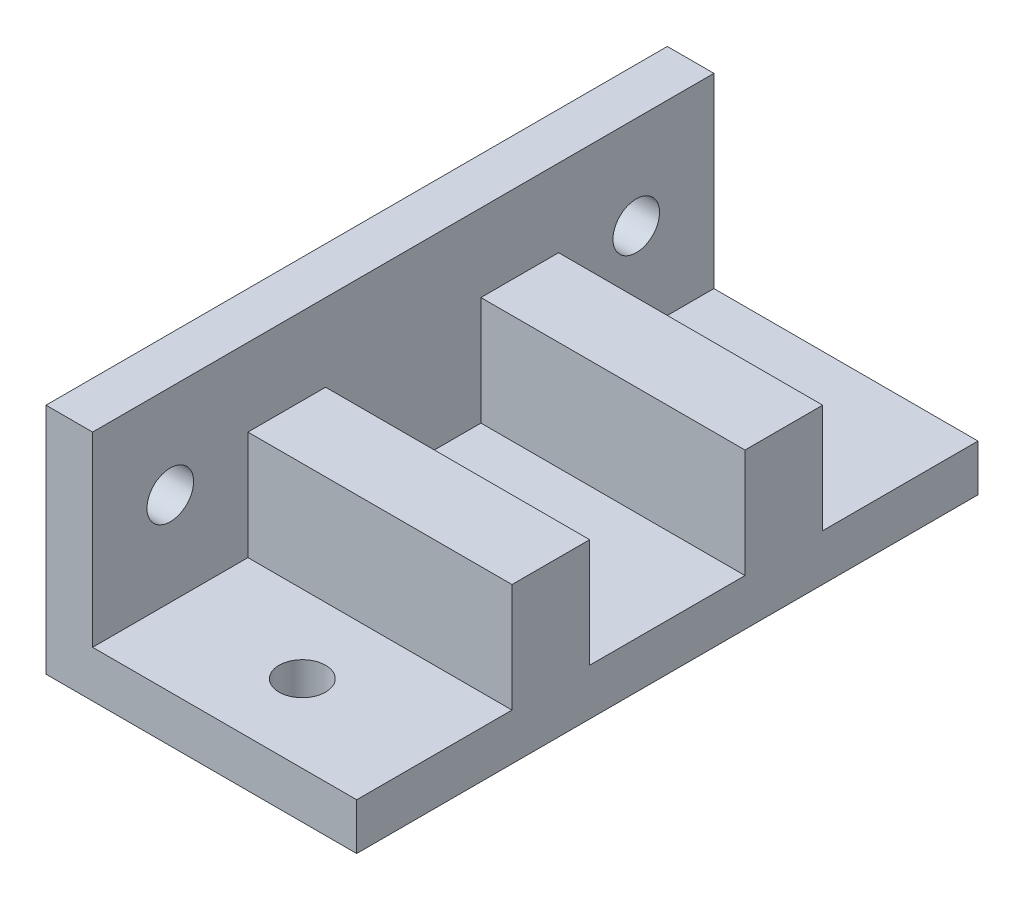
ISO-10303-21;
HEADER;
FILE_DESCRIPTION(('STEP AP214'),'2;1');
FILE_NAME('part.step','',(''),(''),'','','');
FILE_SCHEMA(('AUTOMOTIVE_DESIGN { 1 0 10303 214 1 1 1 1 }'));
ENDSEC;
DATA;
#1=APPLICATION_CONTEXT('core data for automotive mechanical design processes');
#2=APPLICATION_PROTOCOL_DEFINITION('international standard','automotive_design',2000,#1);
#3=PRODUCT_CONTEXT('',#1,'mechanical');
#4=PRODUCT('Part','Part','',(#3));
#5=PRODUCT_RELATED_PRODUCT_CATEGORY('part','',(#4));
#6=PRODUCT_DEFINITION_FORMATION('','',#4);
#7=PRODUCT_DEFINITION_CONTEXT('part definition',#1,'design');
#8=PRODUCT_DEFINITION('design','',#6,#7);
#9=PRODUCT_DEFINITION_SHAPE('','',#8);
#10=(LENGTH_UNIT() NAMED_UNIT(*) SI_UNIT(.MILLI.,.METRE.));
#11=(NAMED_UNIT(*) PLANE_ANGLE_UNIT() SI_UNIT($,.RADIAN.));
#12=(NAMED_UNIT(*) SI_UNIT($,.STERADIAN.) SOLID_ANGLE_UNIT());
#13=UNCERTAINTY_MEASURE_WITH_UNIT(LENGTH_MEASURE(1.E-05),#10,'distance_accuracy_value','');
#14=(GEOMETRIC_REPRESENTATION_CONTEXT(3) GLOBAL_UNCERTAINTY_ASSIGNED_CONTEXT((#13)) GLOBAL_UNIT_ASSIGNED_CONTEXT((#10,
#11,#12)) REPRESENTATION_CONTEXT('',''));
#15=CARTESIAN_POINT('',(0.,0.,0.));
#16=DIRECTION('',(0.,0.,1.));
#17=DIRECTION('',(1.,0.,0.));
#18=AXIS2_PLACEMENT_3D('',#15,#16,#17);
#19=CARTESIAN_POINT('',(3.,3.,40.));
#20=DIRECTION('',(0.,-1.,0.));
#21=DIRECTION('',(0.,0.,-1.));
#22=AXIS2_PLACEMENT_3D('',#19,#20,#21);
#23=PLANE('',#22);
#24=CARTESIAN_POINT('',(11.5,3.,5.00000000000001));
#25=DIRECTION('',(0.,1.,0.));
#26=DIRECTION('',(0.,0.,-1.));
#27=AXIS2_PLACEMENT_3D('',#24,#25,#26);
#28=CIRCLE('',#27,1.5);
#29=CARTESIAN_POINT('',(11.5,3.,3.50000000000001));
#30=VERTEX_POINT('',#29);
#31=EDGE_CURVE('E217',#30,#30,#28,.T.);
#32=ORIENTED_EDGE('',*,*,#31,.F.);
#33=EDGE_LOOP('',(#32));
#34=FACE_BOUND('',#33,.T.);
#35=DIRECTION('',(-1.,0.,0.));
#36=VECTOR('',#35,1.);
#37=CARTESIAN_POINT('',(3.,3.,10.));
#38=LINE('',#37,#36);
#39=CARTESIAN_POINT('',(20.,3.,10.));
#40=VERTEX_POINT('',#39);
#41=CARTESIAN_POINT('',(3.,3.,10.));
#42=VERTEX_POINT('',#41);
#43=EDGE_CURVE('E168',#40,#42,#38,.T.);
#44=ORIENTED_EDGE('',*,*,#43,.F.);
#45=DIRECTION('',(0.,0.,-1.));
#46=VECTOR('',#45,1.);
#47=CARTESIAN_POINT('',(20.,3.,40.));
#48=LINE('',#47,#46);
#49=CARTESIAN_POINT('',(20.,3.,0.));
#50=VERTEX_POINT('',#49);
#51=EDGE_CURVE('E312',#40,#50,#48,.T.);
#52=ORIENTED_EDGE('',*,*,#51,.T.);
#53=DIRECTION('',(-1.,0.,0.));
#54=VECTOR('',#53,1.);
#55=CARTESIAN_POINT('',(3.,3.,0.));
#56=LINE('',#55,#54);
#57=CARTESIAN_POINT('',(3.,3.,0.));
#58=VERTEX_POINT('',#57);
#59=EDGE_CURVE('E285',#50,#58,#56,.T.);
#60=ORIENTED_EDGE('',*,*,#59,.T.);
#61=DIRECTION('',(0.,0.,-1.));
#62=VECTOR('',#61,1.);
#63=CARTESIAN_POINT('',(3.,3.,40.));
#64=LINE('',#63,#62);
#65=EDGE_CURVE('E308',#42,#58,#64,.T.);
#66=ORIENTED_EDGE('',*,*,#65,.F.);
#67=EDGE_LOOP('',(#44,#52,#60,#66));
#68=FACE_BOUND('',#67,.T.);
#69=ADVANCED_FACE('F39',(#34,#68),#23,.F.);
#70=CARTESIAN_POINT('',(11.5,3.,20.));
#71=DIRECTION('',(0.,1.,0.));
#72=DIRECTION('',(0.,0.,1.));
#73=AXIS2_PLACEMENT_3D('',#70,#71,#72);
#74=CIRCLE('',#73,1.5);
#75=CARTESIAN_POINT('',(11.5,3.,21.5));
#76=VERTEX_POINT('',#75);
#77=EDGE_CURVE('E222',#76,#76,#74,.T.);
#78=ORIENTED_EDGE('',*,*,#77,.F.);
#79=EDGE_LOOP('',(#78));
#80=FACE_BOUND('',#79,.T.);
#81=DIRECTION('',(1.,0.,0.));
#82=VECTOR('',#81,1.);
#83=CARTESIAN_POINT('',(3.,3.,15.));
#84=LINE('',#83,#82);
#85=CARTESIAN_POINT('',(3.,3.,15.));
#86=VERTEX_POINT('',#85);
#87=CARTESIAN_POINT('',(20.,3.,15.));
#88=VERTEX_POINT('',#87);
#89=EDGE_CURVE('E152',#86,#88,#84,.T.);
#90=ORIENTED_EDGE('',*,*,#89,.F.);
#91=CARTESIAN_POINT('',(3.,3.,25.));
#92=VERTEX_POINT('',#91);
#93=EDGE_CURVE('E313',#92,#86,#64,.T.);
#94=ORIENTED_EDGE('',*,*,#93,.F.);
#95=DIRECTION('',(-1.,0.,0.));
#96=VECTOR('',#95,1.);
#97=CARTESIAN_POINT('',(3.,3.,25.));
#98=LINE('',#97,#96);
#99=CARTESIAN_POINT('',(20.,3.,25.));
#100=VERTEX_POINT('',#99);
#101=EDGE_CURVE('E186',#100,#92,#98,.T.);
#102=ORIENTED_EDGE('',*,*,#101,.F.);
#103=EDGE_CURVE('E315',#100,#88,#48,.T.);
#104=ORIENTED_EDGE('',*,*,#103,.T.);
#105=EDGE_LOOP('',(#90,#94,#102,#104));
#106=FACE_BOUND('',#105,.T.);
#107=ADVANCED_FACE('F356',(#80,#106),#23,.F.);
#108=CARTESIAN_POINT('',(3.,15.,40.));
#109=DIRECTION('',(-1.,0.,0.));
#110=DIRECTION('',(0.,-1.,0.));
#111=AXIS2_PLACEMENT_3D('',#108,#109,#110);
#112=PLANE('',#111);
#113=CARTESIAN_POINT('',(3.,9.,35.));
#114=DIRECTION('',(1.,0.,0.));
#115=DIRECTION('',(0.,1.,0.));
#116=AXIS2_PLACEMENT_3D('',#113,#114,#115);
#117=CIRCLE('',#116,1.5);
#118=CARTESIAN_POINT('',(3.,10.5,35.));
#119=VERTEX_POINT('',#118);
#120=EDGE_CURVE('E247',#119,#119,#117,.T.);
#121=ORIENTED_EDGE('',*,*,#120,.F.);
#122=EDGE_LOOP('',(#121));
#123=FACE_BOUND('',#122,.T.);
#124=CARTESIAN_POINT('',(3.,9.,5.));
#125=DIRECTION('',(1.,0.,0.));
#126=DIRECTION('',(0.,-1.,0.));
#127=AXIS2_PLACEMENT_3D('',#124,#125,#126);
#128=CIRCLE('',#127,1.5);
#129=CARTESIAN_POINT('',(3.,7.5,5.));
#130=VERTEX_POINT('',#129);
#131=EDGE_CURVE('E238',#130,#130,#128,.T.);
#132=ORIENTED_EDGE('',*,*,#131,.F.);
#133=EDGE_LOOP('',(#132));
#134=FACE_BOUND('',#133,.T.);
#135=DIRECTION('',(0.,-1.,0.));
#136=VECTOR('',#135,1.);
#137=CARTESIAN_POINT('',(3.,10.,10.));
#138=LINE('',#137,#136);
#139=CARTESIAN_POINT('',(3.,10.,10.));
#140=VERTEX_POINT('',#139);
#141=EDGE_CURVE('E177',#140,#42,#138,.T.);
#142=ORIENTED_EDGE('',*,*,#141,.T.);
#143=ORIENTED_EDGE('',*,*,#65,.T.);
#144=DIRECTION('',(0.,1.,0.));
#145=VECTOR('',#144,1.);
#146=CARTESIAN_POINT('',(3.,15.,0.));
#147=LINE('',#146,#145);
#148=CARTESIAN_POINT('',(3.,15.,0.));
#149=VERTEX_POINT('',#148);
#150=EDGE_CURVE('E289',#58,#149,#147,.T.);
#151=ORIENTED_EDGE('',*,*,#150,.T.);
#152=DIRECTION('',(0.,0.,-1.));
#153=VECTOR('',#152,1.);
#154=CARTESIAN_POINT('',(3.,15.,40.));
#155=LINE('',#154,#153);
#156=CARTESIAN_POINT('',(3.,15.,40.));
#157=VERTEX_POINT('',#156);
#158=EDGE_CURVE('E304',#157,#149,#155,.T.);
#159=ORIENTED_EDGE('',*,*,#158,.F.);
#160=DIRECTION('',(0.,1.,0.));
#161=VECTOR('',#160,1.);
#162=CARTESIAN_POINT('',(3.,15.,40.));
#163=LINE('',#162,#161);
#164=CARTESIAN_POINT('',(3.,3.,40.));
#165=VERTEX_POINT('',#164);
#166=EDGE_CURVE('E269',#165,#157,#163,.T.);
#167=ORIENTED_EDGE('',*,*,#166,.F.);
#168=CARTESIAN_POINT('',(3.,3.,30.));
#169=VERTEX_POINT('',#168);
#170=EDGE_CURVE('E309',#165,#169,#64,.T.);
#171=ORIENTED_EDGE('',*,*,#170,.T.);
#172=DIRECTION('',(0.,-1.,0.));
#173=VECTOR('',#172,1.);
#174=CARTESIAN_POINT('',(3.,10.,30.));
#175=LINE('',#174,#173);
#176=CARTESIAN_POINT('',(3.,10.,30.));
#177=VERTEX_POINT('',#176);
#178=EDGE_CURVE('E213',#177,#169,#175,.T.);
#179=ORIENTED_EDGE('',*,*,#178,.F.);
#180=DIRECTION('',(0.,0.,1.));
#181=VECTOR('',#180,1.);
#182=CARTESIAN_POINT('',(3.,10.,30.));
#183=LINE('',#182,#181);
#184=CARTESIAN_POINT('',(3.,10.,25.));
#185=VERTEX_POINT('',#184);
#186=EDGE_CURVE('E181',#185,#177,#183,.T.);
#187=ORIENTED_EDGE('',*,*,#186,.F.);
#188=DIRECTION('',(0.,-1.,0.));
#189=VECTOR('',#188,1.);
#190=CARTESIAN_POINT('',(3.,10.,25.));
#191=LINE('',#190,#189);
#192=EDGE_CURVE('E196',#185,#92,#191,.T.);
#193=ORIENTED_EDGE('',*,*,#192,.T.);
#194=ORIENTED_EDGE('',*,*,#93,.T.);
#195=DIRECTION('',(0.,-1.,0.));
#196=VECTOR('',#195,1.);
#197=CARTESIAN_POINT('',(3.,10.,15.));
#198=LINE('',#197,#196);
#199=CARTESIAN_POINT('',(3.,10.,15.));
#200=VERTEX_POINT('',#199);
#201=EDGE_CURVE('E55',#200,#86,#198,.T.);
#202=ORIENTED_EDGE('',*,*,#201,.F.);
#203=DIRECTION('',(0.,0.,1.));
#204=VECTOR('',#203,1.);
#205=CARTESIAN_POINT('',(3.,10.,10.));
#206=LINE('',#205,#204);
#207=EDGE_CURVE('E59',#140,#200,#206,.T.);
#208=ORIENTED_EDGE('',*,*,#207,.F.);
#209=EDGE_LOOP('',(#142,#143,#151,#159,#167,#171,#179,#187,#193,#194,#202,#208));
#210=FACE_BOUND('',#209,.T.);
#211=ADVANCED_FACE('F333',(#123,#134,#210),#112,.F.);
#212=CARTESIAN_POINT('',(11.5,3.,35.));
#213=DIRECTION('',(0.,1.,0.));
#214=DIRECTION('',(0.,0.,1.));
#215=AXIS2_PLACEMENT_3D('',#212,#213,#214);
#216=CIRCLE('',#215,1.5);
#217=CARTESIAN_POINT('',(11.5,3.,36.5));
#218=VERTEX_POINT('',#217);
#219=EDGE_CURVE('E223',#218,#218,#216,.T.);
#220=ORIENTED_EDGE('',*,*,#219,.F.);
#221=EDGE_LOOP('',(#220));
#222=FACE_BOUND('',#221,.T.);
#223=DIRECTION('',(1.,0.,0.));
#224=VECTOR('',#223,1.);
#225=CARTESIAN_POINT('',(3.,3.,30.));
#226=LINE('',#225,#224);
#227=CARTESIAN_POINT('',(20.,3.,30.));
#228=VERTEX_POINT('',#227);
#229=EDGE_CURVE('E180',#169,#228,#226,.T.);
#230=ORIENTED_EDGE('',*,*,#229,.F.);
#231=ORIENTED_EDGE('',*,*,#170,.F.);
#232=DIRECTION('',(-1.,0.,0.));
#233=VECTOR('',#232,1.);
#234=CARTESIAN_POINT('',(3.,3.,40.));
#235=LINE('',#234,#233);
#236=CARTESIAN_POINT('',(20.,3.,40.));
#237=VERTEX_POINT('',#236);
#238=EDGE_CURVE('E266',#237,#165,#235,.T.);
#239=ORIENTED_EDGE('',*,*,#238,.F.);
#240=EDGE_CURVE('E48',#237,#228,#48,.T.);
#241=ORIENTED_EDGE('',*,*,#240,.T.);
#242=EDGE_LOOP('',(#230,#231,#239,#241));
#243=FACE_BOUND('',#242,.T.);
#244=ADVANCED_FACE('F360',(#222,#243),#23,.F.);
#245=CARTESIAN_POINT('',(20.,0.,40.));
#246=DIRECTION('',(0.,1.,0.));
#247=DIRECTION('',(-1.,0.,0.));
#248=AXIS2_PLACEMENT_3D('',#245,#246,#247);
#249=PLANE('',#248);
#250=CARTESIAN_POINT('',(11.5,0.,5.00000000000001));
#251=DIRECTION('',(0.,1.,0.));
#252=DIRECTION('',(0.,0.,-1.));
#253=AXIS2_PLACEMENT_3D('',#250,#251,#252);
#254=CIRCLE('',#253,1.5);
#255=CARTESIAN_POINT('',(11.5,0.,3.50000000000001));
#256=VERTEX_POINT('',#255);
#257=EDGE_CURVE('E227',#256,#256,#254,.T.);
#258=ORIENTED_EDGE('',*,*,#257,.T.);
#259=EDGE_LOOP('',(#258));
#260=FACE_BOUND('',#259,.T.);
#261=CARTESIAN_POINT('',(11.5,0.,35.));
#262=DIRECTION('',(0.,1.,0.));
#263=DIRECTION('',(0.,0.,1.));
#264=AXIS2_PLACEMENT_3D('',#261,#262,#263);
#265=CIRCLE('',#264,1.5);
#266=CARTESIAN_POINT('',(11.5,0.,36.5));
#267=VERTEX_POINT('',#266);
#268=EDGE_CURVE('E218',#267,#267,#265,.T.);
#269=ORIENTED_EDGE('',*,*,#268,.T.);
#270=EDGE_LOOP('',(#269));
#271=FACE_BOUND('',#270,.T.);
#272=CARTESIAN_POINT('',(11.5,0.,20.));
#273=DIRECTION('',(0.,1.,0.));
#274=DIRECTION('',(0.,0.,1.));
#275=AXIS2_PLACEMENT_3D('',#272,#273,#274);
#276=CIRCLE('',#275,1.5);
#277=CARTESIAN_POINT('',(11.5,0.,21.5));
#278=VERTEX_POINT('',#277);
#279=EDGE_CURVE('E234',#278,#278,#276,.T.);
#280=ORIENTED_EDGE('',*,*,#279,.T.);
#281=EDGE_LOOP('',(#280));
#282=FACE_BOUND('',#281,.T.);
#283=DIRECTION('',(1.,0.,0.));
#284=VECTOR('',#283,1.);
#285=CARTESIAN_POINT('',(20.,0.,0.));
#286=LINE('',#285,#284);
#287=CARTESIAN_POINT('',(0.,0.,0.));
#288=VERTEX_POINT('',#287);
#289=CARTESIAN_POINT('',(20.,0.,0.));
#290=VERTEX_POINT('',#289);
#291=EDGE_CURVE('E246',#288,#290,#286,.T.);
#292=ORIENTED_EDGE('',*,*,#291,.T.);
#293=DIRECTION('',(0.,0.,-1.));
#294=VECTOR('',#293,1.);
#295=CARTESIAN_POINT('',(20.,0.,40.));
#296=LINE('',#295,#294);
#297=CARTESIAN_POINT('',(20.,0.,40.));
#298=VERTEX_POINT('',#297);
#299=EDGE_CURVE('E11',#298,#290,#296,.T.);
#300=ORIENTED_EDGE('',*,*,#299,.F.);
#301=DIRECTION('',(1.,0.,0.));
#302=VECTOR('',#301,1.);
#303=CARTESIAN_POINT('',(20.,0.,40.));
#304=LINE('',#303,#302);
#305=CARTESIAN_POINT('',(0.,0.,40.));
#306=VERTEX_POINT('',#305);
#307=EDGE_CURVE('E258',#306,#298,#304,.T.);
#308=ORIENTED_EDGE('',*,*,#307,.F.);
#309=DIRECTION('',(0.,0.,-1.));
#310=VECTOR('',#309,1.);
#311=CARTESIAN_POINT('',(0.,0.,40.));
#312=LINE('',#311,#310);
#313=EDGE_CURVE('E278',#306,#288,#312,.T.);
#314=ORIENTED_EDGE('',*,*,#313,.T.);
#315=EDGE_LOOP('',(#292,#300,#308,#314));
#316=FACE_BOUND('',#315,.T.);
#317=ADVANCED_FACE('F41',(#260,#271,#282,#316),#249,.F.);
#318=CARTESIAN_POINT('',(20.,3.,40.));
#319=DIRECTION('',(-1.,0.,0.));
#320=DIRECTION('',(0.,0.,1.));
#321=AXIS2_PLACEMENT_3D('',#318,#319,#320);
#322=PLANE('',#321);
#323=DIRECTION('',(0.,1.,0.));
#324=VECTOR('',#323,1.);
#325=CARTESIAN_POINT('',(20.,3.,0.));
#326=LINE('',#325,#324);
#327=EDGE_CURVE('E282',#290,#50,#326,.T.);
#328=ORIENTED_EDGE('',*,*,#327,.T.);
#329=ORIENTED_EDGE('',*,*,#51,.F.);
#330=DIRECTION('',(0.,-1.,0.));
#331=VECTOR('',#330,1.);
#332=CARTESIAN_POINT('',(20.,10.,10.));
#333=LINE('',#332,#331);
#334=CARTESIAN_POINT('',(20.,10.,10.));
#335=VERTEX_POINT('',#334);
#336=EDGE_CURVE('E156',#335,#40,#333,.T.);
#337=ORIENTED_EDGE('',*,*,#336,.F.);
#338=DIRECTION('',(0.,0.,-1.));
#339=VECTOR('',#338,1.);
#340=CARTESIAN_POINT('',(20.,10.,10.));
#341=LINE('',#340,#339);
#342=CARTESIAN_POINT('',(20.,10.,15.));
#343=VERTEX_POINT('',#342);
#344=EDGE_CURVE('E143',#343,#335,#341,.T.);
#345=ORIENTED_EDGE('',*,*,#344,.F.);
#346=DIRECTION('',(0.,-1.,0.));
#347=VECTOR('',#346,1.);
#348=CARTESIAN_POINT('',(20.,10.,15.));
#349=LINE('',#348,#347);
#350=EDGE_CURVE('E150',#343,#88,#349,.T.);
#351=ORIENTED_EDGE('',*,*,#350,.T.);
#352=ORIENTED_EDGE('',*,*,#103,.F.);
#353=DIRECTION('',(0.,-1.,0.));
#354=VECTOR('',#353,1.);
#355=CARTESIAN_POINT('',(20.,10.,25.));
#356=LINE('',#355,#354);
#357=CARTESIAN_POINT('',(20.,10.,25.));
#358=VERTEX_POINT('',#357);
#359=EDGE_CURVE('E205',#358,#100,#356,.T.);
#360=ORIENTED_EDGE('',*,*,#359,.F.);
#361=DIRECTION('',(0.,0.,-1.));
#362=VECTOR('',#361,1.);
#363=CARTESIAN_POINT('',(20.,10.,30.));
#364=LINE('',#363,#362);
#365=CARTESIAN_POINT('',(20.,10.,30.));
#366=VERTEX_POINT('',#365);
#367=EDGE_CURVE('E189',#366,#358,#364,.T.);
#368=ORIENTED_EDGE('',*,*,#367,.F.);
#369=DIRECTION('',(0.,-1.,0.));
#370=VECTOR('',#369,1.);
#371=CARTESIAN_POINT('',(20.,10.,30.));
#372=LINE('',#371,#370);
#373=EDGE_CURVE('E209',#366,#228,#372,.T.);
#374=ORIENTED_EDGE('',*,*,#373,.T.);
#375=ORIENTED_EDGE('',*,*,#240,.F.);
#376=DIRECTION('',(0.,1.,0.));
#377=VECTOR('',#376,1.);
#378=CARTESIAN_POINT('',(20.,3.,40.));
#379=LINE('',#378,#377);
#380=EDGE_CURVE('E262',#298,#237,#379,.T.);
#381=ORIENTED_EDGE('',*,*,#380,.F.);
#382=ORIENTED_EDGE('',*,*,#299,.T.);
#383=EDGE_LOOP('',(#328,#329,#337,#345,#351,#352,#360,#368,#374,#375,#381,#382));
#384=FACE_BOUND('',#383,.T.);
#385=ADVANCED_FACE('F159',(#384),#322,.F.);
#386=CARTESIAN_POINT('',(0.,15.,40.));
#387=DIRECTION('',(0.,-1.,0.));
#388=DIRECTION('',(0.,0.,-1.));
#389=AXIS2_PLACEMENT_3D('',#386,#387,#388);
#390=PLANE('',#389);
#391=DIRECTION('',(-1.,0.,0.));
#392=VECTOR('',#391,1.);
#393=CARTESIAN_POINT('',(0.,15.,0.));
#394=LINE('',#393,#392);
#395=CARTESIAN_POINT('',(0.,15.,0.));
#396=VERTEX_POINT('',#395);
#397=EDGE_CURVE('E292',#149,#396,#394,.T.);
#398=ORIENTED_EDGE('',*,*,#397,.T.);
#399=DIRECTION('',(0.,0.,-1.));
#400=VECTOR('',#399,1.);
#401=CARTESIAN_POINT('',(0.,15.,40.));
#402=LINE('',#401,#400);
#403=CARTESIAN_POINT('',(0.,15.,40.));
#404=VERTEX_POINT('',#403);
#405=EDGE_CURVE('E300',#404,#396,#402,.T.);
#406=ORIENTED_EDGE('',*,*,#405,.F.);
#407=DIRECTION('',(-1.,0.,0.));
#408=VECTOR('',#407,1.);
#409=CARTESIAN_POINT('',(0.,15.,40.));
#410=LINE('',#409,#408);
#411=EDGE_CURVE('E272',#157,#404,#410,.T.);
#412=ORIENTED_EDGE('',*,*,#411,.F.);
#413=ORIENTED_EDGE('',*,*,#158,.T.);
#414=EDGE_LOOP('',(#398,#406,#412,#413));
#415=FACE_BOUND('',#414,.T.);
#416=ADVANCED_FACE('F337',(#415),#390,.F.);
#417=CARTESIAN_POINT('',(0.,0.,40.));
#418=DIRECTION('',(1.,0.,0.));
#419=DIRECTION('',(0.,0.,-1.));
#420=AXIS2_PLACEMENT_3D('',#417,#418,#419);
#421=PLANE('',#420);
#422=CARTESIAN_POINT('',(0.,9.,35.));
#423=DIRECTION('',(1.,0.,0.));
#424=DIRECTION('',(0.,1.,0.));
#425=AXIS2_PLACEMENT_3D('',#422,#423,#424);
#426=CIRCLE('',#425,1.5);
#427=CARTESIAN_POINT('',(0.,10.5,35.));
#428=VERTEX_POINT('',#427);
#429=EDGE_CURVE('E242',#428,#428,#426,.T.);
#430=ORIENTED_EDGE('',*,*,#429,.T.);
#431=EDGE_LOOP('',(#430));
#432=FACE_BOUND('',#431,.T.);
#433=CARTESIAN_POINT('',(0.,9.,5.));
#434=DIRECTION('',(1.,0.,0.));
#435=DIRECTION('',(0.,-1.,0.));
#436=AXIS2_PLACEMENT_3D('',#433,#434,#435);
#437=CIRCLE('',#436,1.5);
#438=CARTESIAN_POINT('',(0.,7.5,5.));
#439=VERTEX_POINT('',#438);
#440=EDGE_CURVE('E251',#439,#439,#437,.T.);
#441=ORIENTED_EDGE('',*,*,#440,.T.);
#442=EDGE_LOOP('',(#441));
#443=FACE_BOUND('',#442,.T.);
#444=DIRECTION('',(0.,-1.,0.));
#445=VECTOR('',#444,1.);
#446=CARTESIAN_POINT('',(0.,0.,0.));
#447=LINE('',#446,#445);
#448=EDGE_CURVE('E263',#396,#288,#447,.T.);
#449=ORIENTED_EDGE('',*,*,#448,.T.);
#450=ORIENTED_EDGE('',*,*,#313,.F.);
#451=DIRECTION('',(0.,-1.,0.));
#452=VECTOR('',#451,1.);
#453=CARTESIAN_POINT('',(0.,0.,40.));
#454=LINE('',#453,#452);
#455=EDGE_CURVE('E275',#404,#306,#454,.T.);
#456=ORIENTED_EDGE('',*,*,#455,.F.);
#457=ORIENTED_EDGE('',*,*,#405,.T.);
#458=EDGE_LOOP('',(#449,#450,#456,#457));
#459=FACE_BOUND('',#458,.T.);
#460=ADVANCED_FACE('F404',(#432,#443,#459),#421,.F.);
#461=CARTESIAN_POINT('',(0.,0.,40.));
#462=DIRECTION('',(0.,0.,-1.));
#463=DIRECTION('',(-1.,0.,0.));
#464=AXIS2_PLACEMENT_3D('',#461,#462,#463);
#465=PLANE('',#464);
#466=ORIENTED_EDGE('',*,*,#307,.T.);
#467=ORIENTED_EDGE('',*,*,#380,.T.);
#468=ORIENTED_EDGE('',*,*,#238,.T.);
#469=ORIENTED_EDGE('',*,*,#166,.T.);
#470=ORIENTED_EDGE('',*,*,#411,.T.);
#471=ORIENTED_EDGE('',*,*,#455,.T.);
#472=EDGE_LOOP('',(#466,#467,#468,#469,#470,#471));
#473=FACE_BOUND('',#472,.T.);
#474=ADVANCED_FACE('F341',(#473),#465,.F.);
#475=CARTESIAN_POINT('',(0.,0.,0.));
#476=DIRECTION('',(0.,0.,-1.));
#477=DIRECTION('',(-1.,0.,0.));
#478=AXIS2_PLACEMENT_3D('',#475,#476,#477);
#479=PLANE('',#478);
#480=ORIENTED_EDGE('',*,*,#291,.F.);
#481=ORIENTED_EDGE('',*,*,#448,.F.);
#482=ORIENTED_EDGE('',*,*,#397,.F.);
#483=ORIENTED_EDGE('',*,*,#150,.F.);
#484=ORIENTED_EDGE('',*,*,#59,.F.);
#485=ORIENTED_EDGE('',*,*,#327,.F.);
#486=EDGE_LOOP('',(#480,#481,#482,#483,#484,#485));
#487=FACE_BOUND('',#486,.T.);
#488=ADVANCED_FACE('F329',(#487),#479,.T.);
#489=CARTESIAN_POINT('',(0.,9.,5.));
#490=DIRECTION('',(1.,0.,0.));
#491=DIRECTION('',(0.,1.,0.));
#492=AXIS2_PLACEMENT_3D('',#489,#490,#491);
#493=CYLINDRICAL_SURFACE('',#492,1.5);
#494=ORIENTED_EDGE('',*,*,#440,.F.);
#495=EDGE_LOOP('',(#494));
#496=FACE_BOUND('',#495,.T.);
#497=ORIENTED_EDGE('',*,*,#131,.T.);
#498=EDGE_LOOP('',(#497));
#499=FACE_BOUND('',#498,.T.);
#500=ADVANCED_FACE('F393',(#496,#499),#493,.F.);
#501=CARTESIAN_POINT('',(0.,9.,35.));
#502=DIRECTION('',(1.,0.,0.));
#503=DIRECTION('',(0.,1.,0.));
#504=AXIS2_PLACEMENT_3D('',#501,#502,#503);
#505=CYLINDRICAL_SURFACE('',#504,1.5);
#506=ORIENTED_EDGE('',*,*,#429,.F.);
#507=EDGE_LOOP('',(#506));
#508=FACE_BOUND('',#507,.T.);
#509=ORIENTED_EDGE('',*,*,#120,.T.);
#510=EDGE_LOOP('',(#509));
#511=FACE_BOUND('',#510,.T.);
#512=ADVANCED_FACE('F383',(#508,#511),#505,.F.);
#513=CARTESIAN_POINT('',(11.5,0.,20.));
#514=DIRECTION('',(0.,1.,0.));
#515=DIRECTION('',(0.,0.,1.));
#516=AXIS2_PLACEMENT_3D('',#513,#514,#515);
#517=CYLINDRICAL_SURFACE('',#516,1.5);
#518=ORIENTED_EDGE('',*,*,#279,.F.);
#519=EDGE_LOOP('',(#518));
#520=FACE_BOUND('',#519,.T.);
#521=ORIENTED_EDGE('',*,*,#77,.T.);
#522=EDGE_LOOP('',(#521));
#523=FACE_BOUND('',#522,.T.);
#524=ADVANCED_FACE('F380',(#520,#523),#517,.F.);
#525=CARTESIAN_POINT('',(11.5,0.,35.));
#526=DIRECTION('',(0.,1.,0.));
#527=DIRECTION('',(0.,0.,1.));
#528=AXIS2_PLACEMENT_3D('',#525,#526,#527);
#529=CYLINDRICAL_SURFACE('',#528,1.5);
#530=ORIENTED_EDGE('',*,*,#268,.F.);
#531=EDGE_LOOP('',(#530));
#532=FACE_BOUND('',#531,.T.);
#533=ORIENTED_EDGE('',*,*,#219,.T.);
#534=EDGE_LOOP('',(#533));
#535=FACE_BOUND('',#534,.T.);
#536=ADVANCED_FACE('F382',(#532,#535),#529,.F.);
#537=CARTESIAN_POINT('',(11.5,0.,5.00000000000001));
#538=DIRECTION('',(0.,1.,0.));
#539=DIRECTION('',(0.,0.,1.));
#540=AXIS2_PLACEMENT_3D('',#537,#538,#539);
#541=CYLINDRICAL_SURFACE('',#540,1.5);
#542=ORIENTED_EDGE('',*,*,#257,.F.);
#543=EDGE_LOOP('',(#542));
#544=FACE_BOUND('',#543,.T.);
#545=ORIENTED_EDGE('',*,*,#31,.T.);
#546=EDGE_LOOP('',(#545));
#547=FACE_BOUND('',#546,.T.);
#548=ADVANCED_FACE('F390',(#544,#547),#541,.F.);
#549=CARTESIAN_POINT('',(3.,10.,30.));
#550=DIRECTION('',(0.,0.,-1.));
#551=DIRECTION('',(-1.,0.,0.));
#552=AXIS2_PLACEMENT_3D('',#549,#550,#551);
#553=PLANE('',#552);
#554=ORIENTED_EDGE('',*,*,#229,.T.);
#555=ORIENTED_EDGE('',*,*,#373,.F.);
#556=DIRECTION('',(1.,0.,0.));
#557=VECTOR('',#556,1.);
#558=CARTESIAN_POINT('',(3.,10.,30.));
#559=LINE('',#558,#557);
#560=EDGE_CURVE('E185',#177,#366,#559,.T.);
#561=ORIENTED_EDGE('',*,*,#560,.F.);
#562=ORIENTED_EDGE('',*,*,#178,.T.);
#563=EDGE_LOOP('',(#554,#555,#561,#562));
#564=FACE_BOUND('',#563,.T.);
#565=ADVANCED_FACE('F346',(#564),#553,.F.);
#566=CARTESIAN_POINT('',(3.,10.,25.));
#567=DIRECTION('',(0.,0.,1.));
#568=DIRECTION('',(1.,0.,0.));
#569=AXIS2_PLACEMENT_3D('',#566,#567,#568);
#570=PLANE('',#569);
#571=ORIENTED_EDGE('',*,*,#101,.T.);
#572=ORIENTED_EDGE('',*,*,#192,.F.);
#573=DIRECTION('',(-1.,0.,0.));
#574=VECTOR('',#573,1.);
#575=CARTESIAN_POINT('',(3.,10.,25.));
#576=LINE('',#575,#574);
#577=EDGE_CURVE('E192',#358,#185,#576,.T.);
#578=ORIENTED_EDGE('',*,*,#577,.F.);
#579=ORIENTED_EDGE('',*,*,#359,.T.);
#580=EDGE_LOOP('',(#571,#572,#578,#579));
#581=FACE_BOUND('',#580,.T.);
#582=ADVANCED_FACE('F358',(#581),#570,.F.);
#583=CARTESIAN_POINT('',(0.,10.,0.));
#584=DIRECTION('',(0.,-1.,0.));
#585=DIRECTION('',(0.,0.,-1.));
#586=AXIS2_PLACEMENT_3D('',#583,#584,#585);
#587=PLANE('',#586);
#588=ORIENTED_EDGE('',*,*,#186,.T.);
#589=ORIENTED_EDGE('',*,*,#560,.T.);
#590=ORIENTED_EDGE('',*,*,#367,.T.);
#591=ORIENTED_EDGE('',*,*,#577,.T.);
#592=EDGE_LOOP('',(#588,#589,#590,#591));
#593=FACE_BOUND('',#592,.T.);
#594=ADVANCED_FACE('F350',(#593),#587,.F.);
#595=CARTESIAN_POINT('',(3.,10.,10.));
#596=DIRECTION('',(0.,0.,1.));
#597=DIRECTION('',(1.,0.,0.));
#598=AXIS2_PLACEMENT_3D('',#595,#596,#597);
#599=PLANE('',#598);
#600=ORIENTED_EDGE('',*,*,#43,.T.);
#601=ORIENTED_EDGE('',*,*,#141,.F.);
#602=DIRECTION('',(-1.,0.,0.));
#603=VECTOR('',#602,1.);
#604=CARTESIAN_POINT('',(3.,10.,10.));
#605=LINE('',#604,#603);
#606=EDGE_CURVE('E173',#335,#140,#605,.T.);
#607=ORIENTED_EDGE('',*,*,#606,.F.);
#608=ORIENTED_EDGE('',*,*,#336,.T.);
#609=EDGE_LOOP('',(#600,#601,#607,#608));
#610=FACE_BOUND('',#609,.T.);
#611=ADVANCED_FACE('F495',(#610),#599,.F.);
#612=CARTESIAN_POINT('',(3.,10.,15.));
#613=DIRECTION('',(0.,0.,-1.));
#614=DIRECTION('',(-1.,0.,0.));
#615=AXIS2_PLACEMENT_3D('',#612,#613,#614);
#616=PLANE('',#615);
#617=ORIENTED_EDGE('',*,*,#89,.T.);
#618=ORIENTED_EDGE('',*,*,#350,.F.);
#619=DIRECTION('',(1.,0.,0.));
#620=VECTOR('',#619,1.);
#621=CARTESIAN_POINT('',(3.,10.,15.));
#622=LINE('',#621,#620);
#623=EDGE_CURVE('E139',#200,#343,#622,.T.);
#624=ORIENTED_EDGE('',*,*,#623,.F.);
#625=ORIENTED_EDGE('',*,*,#201,.T.);
#626=EDGE_LOOP('',(#617,#618,#624,#625));
#627=FACE_BOUND('',#626,.T.);
#628=ADVANCED_FACE('F151',(#627),#616,.F.);
#629=CARTESIAN_POINT('',(0.,10.,0.));
#630=DIRECTION('',(0.,-1.,0.));
#631=DIRECTION('',(0.,0.,-1.));
#632=AXIS2_PLACEMENT_3D('',#629,#630,#631);
#633=PLANE('',#632);
#634=ORIENTED_EDGE('',*,*,#606,.T.);
#635=ORIENTED_EDGE('',*,*,#207,.T.);
#636=ORIENTED_EDGE('',*,*,#623,.T.);
#637=ORIENTED_EDGE('',*,*,#344,.T.);
#638=EDGE_LOOP('',(#634,#635,#636,#637));
#639=FACE_BOUND('',#638,.T.);
#640=ADVANCED_FACE('F141',(#639),#633,.F.);
#641=CLOSED_SHELL('',(#69,#107,#211,#244,#317,#385,#416,#460,#474,#488,#500,#512,#524,#536,#548,
#565,#582,#594,#611,#628,#640));
#642=MANIFOLD_SOLID_BREP('B2',#641);
#643=ADVANCED_BREP_SHAPE_REPRESENTATION('',(#18,#642),#14);
#644=SHAPE_DEFINITION_REPRESENTATION(#9,#643);
ENDSEC;
END-ISO-10303-21;
